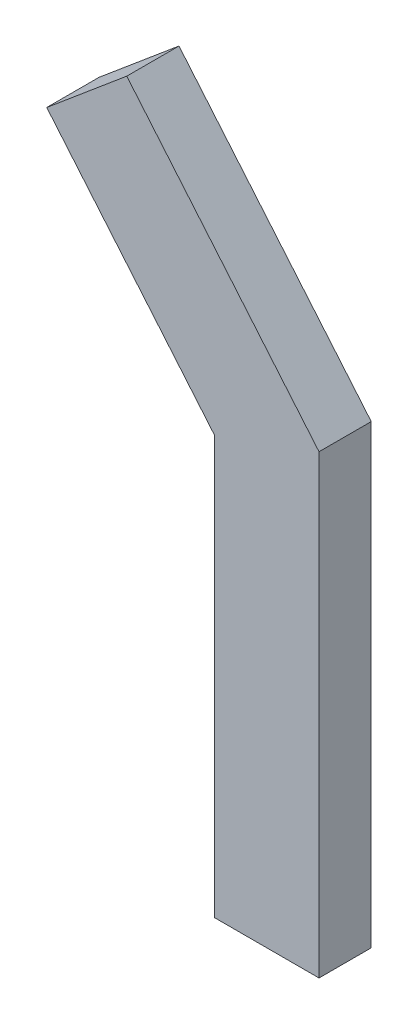
ISO-10303-21;
HEADER;
FILE_DESCRIPTION(('STEP AP214'),'2;1');
FILE_NAME('part.step','',(''),(''),'','','');
FILE_SCHEMA(('AUTOMOTIVE_DESIGN { 1 0 10303 214 1 1 1 1 }'));
ENDSEC;
DATA;
#1=APPLICATION_CONTEXT('core data for automotive mechanical design processes');
#2=APPLICATION_PROTOCOL_DEFINITION('international standard','automotive_design',2000,#1);
#3=PRODUCT_CONTEXT('',#1,'mechanical');
#4=PRODUCT('Part','Part','',(#3));
#5=PRODUCT_RELATED_PRODUCT_CATEGORY('part','',(#4));
#6=PRODUCT_DEFINITION_FORMATION('','',#4);
#7=PRODUCT_DEFINITION_CONTEXT('part definition',#1,'design');
#8=PRODUCT_DEFINITION('design','',#6,#7);
#9=PRODUCT_DEFINITION_SHAPE('','',#8);
#10=(LENGTH_UNIT() NAMED_UNIT(*) SI_UNIT(.MILLI.,.METRE.));
#11=(NAMED_UNIT(*) PLANE_ANGLE_UNIT() SI_UNIT($,.RADIAN.));
#12=(NAMED_UNIT(*) SI_UNIT($,.STERADIAN.) SOLID_ANGLE_UNIT());
#13=UNCERTAINTY_MEASURE_WITH_UNIT(LENGTH_MEASURE(1.E-05),#10,'distance_accuracy_value','');
#14=(GEOMETRIC_REPRESENTATION_CONTEXT(3) GLOBAL_UNCERTAINTY_ASSIGNED_CONTEXT((#13)) GLOBAL_UNIT_ASSIGNED_CONTEXT((#10,
#11,#12)) REPRESENTATION_CONTEXT('',''));
#15=CARTESIAN_POINT('',(0.,0.,0.));
#16=DIRECTION('',(0.,0.,1.));
#17=DIRECTION('',(1.,0.,0.));
#18=AXIS2_PLACEMENT_3D('',#15,#16,#17);
#19=CARTESIAN_POINT('',(0.,0.,0.1));
#20=DIRECTION('',(0.,1.,0.));
#21=DIRECTION('',(0.,0.,1.));
#22=AXIS2_PLACEMENT_3D('',#19,#20,#21);
#23=PLANE('',#22);
#24=DIRECTION('',(1.,0.,0.));
#25=VECTOR('',#24,1.);
#26=CARTESIAN_POINT('',(0.,0.,0.));
#27=LINE('',#26,#25);
#28=CARTESIAN_POINT('',(0.,0.,0.));
#29=VERTEX_POINT('',#28);
#30=CARTESIAN_POINT('',(0.2,0.,0.));
#31=VERTEX_POINT('',#30);
#32=EDGE_CURVE('E117',#29,#31,#27,.T.);
#33=ORIENTED_EDGE('',*,*,#32,.T.);
#34=DIRECTION('',(0.,0.,-1.));
#35=VECTOR('',#34,1.);
#36=CARTESIAN_POINT('',(0.2,0.,0.1));
#37=LINE('',#36,#35);
#38=CARTESIAN_POINT('',(0.2,0.,0.1));
#39=VERTEX_POINT('',#38);
#40=EDGE_CURVE('E11',#39,#31,#37,.T.);
#41=ORIENTED_EDGE('',*,*,#40,.F.);
#42=DIRECTION('',(1.,0.,0.));
#43=VECTOR('',#42,1.);
#44=CARTESIAN_POINT('',(0.,0.,0.1));
#45=LINE('',#44,#43);
#46=CARTESIAN_POINT('',(0.,0.,0.1));
#47=VERTEX_POINT('',#46);
#48=EDGE_CURVE('E127',#47,#39,#45,.T.);
#49=ORIENTED_EDGE('',*,*,#48,.F.);
#50=DIRECTION('',(0.,0.,-1.));
#51=VECTOR('',#50,1.);
#52=CARTESIAN_POINT('',(0.,0.,0.1));
#53=LINE('',#52,#51);
#54=EDGE_CURVE('E113',#47,#29,#53,.T.);
#55=ORIENTED_EDGE('',*,*,#54,.T.);
#56=EDGE_LOOP('',(#33,#41,#49,#55));
#57=FACE_BOUND('',#56,.T.);
#58=ADVANCED_FACE('F33',(#57),#23,.F.);
#59=CARTESIAN_POINT('',(0.2,0.,0.1));
#60=DIRECTION('',(-1.,0.,0.));
#61=DIRECTION('',(0.,0.,1.));
#62=AXIS2_PLACEMENT_3D('',#59,#60,#61);
#63=PLANE('',#62);
#64=DIRECTION('',(0.,1.,0.));
#65=VECTOR('',#64,1.);
#66=CARTESIAN_POINT('',(0.2,0.,0.));
#67=LINE('',#66,#65);
#68=CARTESIAN_POINT('',(0.2,0.872794046853241,0.));
#69=VERTEX_POINT('',#68);
#70=EDGE_CURVE('E120',#31,#69,#67,.T.);
#71=ORIENTED_EDGE('',*,*,#70,.T.);
#72=DIRECTION('',(0.,0.,-1.));
#73=VECTOR('',#72,1.);
#74=CARTESIAN_POINT('',(0.2,0.872794046853241,0.1));
#75=LINE('',#74,#73);
#76=CARTESIAN_POINT('',(0.2,0.872794046853241,0.1));
#77=VERTEX_POINT('',#76);
#78=EDGE_CURVE('E41',#77,#69,#75,.T.);
#79=ORIENTED_EDGE('',*,*,#78,.F.);
#80=DIRECTION('',(0.,1.,0.));
#81=VECTOR('',#80,1.);
#82=CARTESIAN_POINT('',(0.2,0.,0.1));
#83=LINE('',#82,#81);
#84=EDGE_CURVE('E86',#39,#77,#83,.T.);
#85=ORIENTED_EDGE('',*,*,#84,.F.);
#86=ORIENTED_EDGE('',*,*,#40,.T.);
#87=EDGE_LOOP('',(#71,#79,#85,#86));
#88=FACE_BOUND('',#87,.T.);
#89=ADVANCED_FACE('F151',(#88),#63,.F.);
#90=CARTESIAN_POINT('',(0.2,0.872794046853241,0.1));
#91=DIRECTION('',(-0.766044443118978,-0.64278760968654,0.));
#92=DIRECTION('',(0.64278760968654,-0.766044443118978,0.));
#93=AXIS2_PLACEMENT_3D('',#90,#91,#92);
#94=PLANE('',#93);
#95=DIRECTION('',(-0.64278760968654,0.766044443118977,0.));
#96=VECTOR('',#95,1.);
#97=CARTESIAN_POINT('',(0.2,0.872794046853241,0.));
#98=LINE('',#97,#96);
#99=CARTESIAN_POINT('',(-0.168184916219475,1.3115797434968,0.));
#100=VERTEX_POINT('',#99);
#101=EDGE_CURVE('E122',#69,#100,#98,.T.);
#102=ORIENTED_EDGE('',*,*,#101,.T.);
#103=DIRECTION('',(0.,0.,-1.));
#104=VECTOR('',#103,1.);
#105=CARTESIAN_POINT('',(-0.168184916219475,1.3115797434968,0.1));
#106=LINE('',#105,#104);
#107=CARTESIAN_POINT('',(-0.168184916219475,1.3115797434968,0.1));
#108=VERTEX_POINT('',#107);
#109=EDGE_CURVE('E108',#108,#100,#106,.T.);
#110=ORIENTED_EDGE('',*,*,#109,.F.);
#111=DIRECTION('',(-0.64278760968654,0.766044443118977,0.));
#112=VECTOR('',#111,1.);
#113=CARTESIAN_POINT('',(0.2,0.872794046853241,0.1));
#114=LINE('',#113,#112);
#115=EDGE_CURVE('E99',#77,#108,#114,.T.);
#116=ORIENTED_EDGE('',*,*,#115,.F.);
#117=ORIENTED_EDGE('',*,*,#78,.T.);
#118=EDGE_LOOP('',(#102,#110,#116,#117));
#119=FACE_BOUND('',#118,.T.);
#120=ADVANCED_FACE('F133',(#119),#94,.F.);
#121=CARTESIAN_POINT('',(-0.32139380484327,1.18302222155949,0.1));
#122=DIRECTION('',(0.642787609686541,-0.766044443118977,0.));
#123=DIRECTION('',(0.766044443118977,0.642787609686541,0.));
#124=AXIS2_PLACEMENT_3D('',#121,#122,#123);
#125=PLANE('',#124);
#126=DIRECTION('',(-0.766044443118977,-0.642787609686541,0.));
#127=VECTOR('',#126,1.);
#128=CARTESIAN_POINT('',(-0.32139380484327,1.18302222155949,0.));
#129=LINE('',#128,#127);
#130=CARTESIAN_POINT('',(-0.32139380484327,1.18302222155949,0.));
#131=VERTEX_POINT('',#130);
#132=EDGE_CURVE('E107',#100,#131,#129,.T.);
#133=ORIENTED_EDGE('',*,*,#132,.T.);
#134=DIRECTION('',(0.,0.,-1.));
#135=VECTOR('',#134,1.);
#136=CARTESIAN_POINT('',(-0.32139380484327,1.18302222155949,0.1));
#137=LINE('',#136,#135);
#138=CARTESIAN_POINT('',(-0.32139380484327,1.18302222155949,0.1));
#139=VERTEX_POINT('',#138);
#140=EDGE_CURVE('E104',#139,#131,#137,.T.);
#141=ORIENTED_EDGE('',*,*,#140,.F.);
#142=DIRECTION('',(-0.766044443118977,-0.642787609686541,0.));
#143=VECTOR('',#142,1.);
#144=CARTESIAN_POINT('',(-0.32139380484327,1.18302222155949,0.1));
#145=LINE('',#144,#143);
#146=EDGE_CURVE('E93',#108,#139,#145,.T.);
#147=ORIENTED_EDGE('',*,*,#146,.F.);
#148=ORIENTED_EDGE('',*,*,#109,.T.);
#149=EDGE_LOOP('',(#133,#141,#147,#148));
#150=FACE_BOUND('',#149,.T.);
#151=ADVANCED_FACE('F105',(#150),#125,.F.);
#152=CARTESIAN_POINT('',(0.,0.8,0.1));
#153=DIRECTION('',(0.766044443118977,0.64278760968654,0.));
#154=DIRECTION('',(-0.64278760968654,0.766044443118978,0.));
#155=AXIS2_PLACEMENT_3D('',#152,#153,#154);
#156=PLANE('',#155);
#157=DIRECTION('',(0.64278760968654,-0.766044443118977,0.));
#158=VECTOR('',#157,1.);
#159=CARTESIAN_POINT('',(0.,0.8,0.));
#160=LINE('',#159,#158);
#161=CARTESIAN_POINT('',(0.,0.8,0.));
#162=VERTEX_POINT('',#161);
#163=EDGE_CURVE('E72',#131,#162,#160,.T.);
#164=ORIENTED_EDGE('',*,*,#163,.T.);
#165=DIRECTION('',(0.,0.,-1.));
#166=VECTOR('',#165,1.);
#167=CARTESIAN_POINT('',(0.,0.8,0.1));
#168=LINE('',#167,#166);
#169=CARTESIAN_POINT('',(0.,0.8,0.1));
#170=VERTEX_POINT('',#169);
#171=EDGE_CURVE('E109',#170,#162,#168,.T.);
#172=ORIENTED_EDGE('',*,*,#171,.F.);
#173=DIRECTION('',(0.64278760968654,-0.766044443118977,0.));
#174=VECTOR('',#173,1.);
#175=CARTESIAN_POINT('',(0.,0.8,0.1));
#176=LINE('',#175,#174);
#177=EDGE_CURVE('E97',#139,#170,#176,.T.);
#178=ORIENTED_EDGE('',*,*,#177,.F.);
#179=ORIENTED_EDGE('',*,*,#140,.T.);
#180=EDGE_LOOP('',(#164,#172,#178,#179));
#181=FACE_BOUND('',#180,.T.);
#182=ADVANCED_FACE('F111',(#181),#156,.F.);
#183=CARTESIAN_POINT('',(0.,0.,0.1));
#184=DIRECTION('',(1.,0.,0.));
#185=DIRECTION('',(0.,0.,-1.));
#186=AXIS2_PLACEMENT_3D('',#183,#184,#185);
#187=PLANE('',#186);
#188=DIRECTION('',(0.,-1.,0.));
#189=VECTOR('',#188,1.);
#190=CARTESIAN_POINT('',(0.,0.,0.));
#191=LINE('',#190,#189);
#192=EDGE_CURVE('E78',#162,#29,#191,.T.);
#193=ORIENTED_EDGE('',*,*,#192,.T.);
#194=ORIENTED_EDGE('',*,*,#54,.F.);
#195=DIRECTION('',(0.,-1.,0.));
#196=VECTOR('',#195,1.);
#197=CARTESIAN_POINT('',(0.,0.,0.1));
#198=LINE('',#197,#196);
#199=EDGE_CURVE('E49',#170,#47,#198,.T.);
#200=ORIENTED_EDGE('',*,*,#199,.F.);
#201=ORIENTED_EDGE('',*,*,#171,.T.);
#202=EDGE_LOOP('',(#193,#194,#200,#201));
#203=FACE_BOUND('',#202,.T.);
#204=ADVANCED_FACE('F140',(#203),#187,.F.);
#205=CARTESIAN_POINT('',(0.,0.,0.1));
#206=DIRECTION('',(0.,0.,1.));
#207=DIRECTION('',(1.,0.,0.));
#208=AXIS2_PLACEMENT_3D('',#205,#206,#207);
#209=PLANE('',#208);
#210=ORIENTED_EDGE('',*,*,#48,.T.);
#211=ORIENTED_EDGE('',*,*,#84,.T.);
#212=ORIENTED_EDGE('',*,*,#115,.T.);
#213=ORIENTED_EDGE('',*,*,#146,.T.);
#214=ORIENTED_EDGE('',*,*,#177,.T.);
#215=ORIENTED_EDGE('',*,*,#199,.T.);
#216=EDGE_LOOP('',(#210,#211,#212,#213,#214,#215));
#217=FACE_BOUND('',#216,.T.);
#218=ADVANCED_FACE('F95',(#217),#209,.T.);
#219=CARTESIAN_POINT('',(0.,0.,0.));
#220=DIRECTION('',(0.,0.,1.));
#221=DIRECTION('',(1.,0.,0.));
#222=AXIS2_PLACEMENT_3D('',#219,#220,#221);
#223=PLANE('',#222);
#224=ORIENTED_EDGE('',*,*,#32,.F.);
#225=ORIENTED_EDGE('',*,*,#192,.F.);
#226=ORIENTED_EDGE('',*,*,#163,.F.);
#227=ORIENTED_EDGE('',*,*,#132,.F.);
#228=ORIENTED_EDGE('',*,*,#101,.F.);
#229=ORIENTED_EDGE('',*,*,#70,.F.);
#230=EDGE_LOOP('',(#224,#225,#226,#227,#228,#229));
#231=FACE_BOUND('',#230,.T.);
#232=ADVANCED_FACE('F136',(#231),#223,.F.);
#233=CLOSED_SHELL('',(#58,#89,#120,#151,#182,#204,#218,#232));
#234=MANIFOLD_SOLID_BREP('B2',#233);
#235=ADVANCED_BREP_SHAPE_REPRESENTATION('',(#18,#234),#14);
#236=SHAPE_DEFINITION_REPRESENTATION(#9,#235);
ENDSEC;
END-ISO-10303-21;
